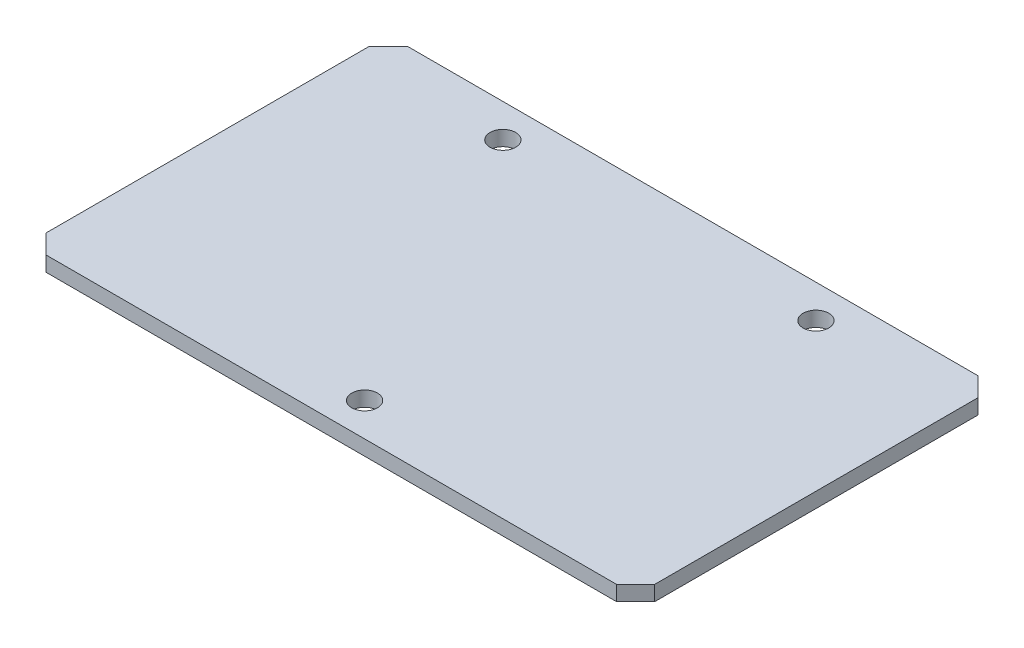
ISO-10303-21;
HEADER;
FILE_DESCRIPTION(('STEP AP214'),'2;1');
FILE_NAME('part.step','',(''),(''),'','','');
FILE_SCHEMA(('AUTOMOTIVE_DESIGN { 1 0 10303 214 1 1 1 1 }'));
ENDSEC;
DATA;
#1=APPLICATION_CONTEXT('core data for automotive mechanical design processes');
#2=APPLICATION_PROTOCOL_DEFINITION('international standard','automotive_design',2000,#1);
#3=PRODUCT_CONTEXT('',#1,'mechanical');
#4=PRODUCT('Part','Part','',(#3));
#5=PRODUCT_RELATED_PRODUCT_CATEGORY('part','',(#4));
#6=PRODUCT_DEFINITION_FORMATION('','',#4);
#7=PRODUCT_DEFINITION_CONTEXT('part definition',#1,'design');
#8=PRODUCT_DEFINITION('design','',#6,#7);
#9=PRODUCT_DEFINITION_SHAPE('','',#8);
#10=(LENGTH_UNIT() NAMED_UNIT(*) SI_UNIT(.MILLI.,.METRE.));
#11=(NAMED_UNIT(*) PLANE_ANGLE_UNIT() SI_UNIT($,.RADIAN.));
#12=(NAMED_UNIT(*) SI_UNIT($,.STERADIAN.) SOLID_ANGLE_UNIT());
#13=UNCERTAINTY_MEASURE_WITH_UNIT(LENGTH_MEASURE(1.E-05),#10,'distance_accuracy_value','');
#14=(GEOMETRIC_REPRESENTATION_CONTEXT(3) GLOBAL_UNCERTAINTY_ASSIGNED_CONTEXT((#13)) GLOBAL_UNIT_ASSIGNED_CONTEXT((#10,
#11,#12)) REPRESENTATION_CONTEXT('',''));
#15=CARTESIAN_POINT('',(0.,0.,0.));
#16=DIRECTION('',(0.,0.,1.));
#17=DIRECTION('',(1.,0.,0.));
#18=AXIS2_PLACEMENT_3D('',#15,#16,#17);
#19=CARTESIAN_POINT('',(32.,1.57875,19.));
#20=DIRECTION('',(-1.,0.,0.));
#21=DIRECTION('',(0.,0.,1.));
#22=AXIS2_PLACEMENT_3D('',#19,#20,#21);
#23=PLANE('',#22);
#24=DIRECTION('',(0.,0.,-1.));
#25=VECTOR('',#24,1.);
#26=CARTESIAN_POINT('',(32.,1.57875,19.));
#27=LINE('',#26,#25);
#28=CARTESIAN_POINT('',(32.,1.57875,17.));
#29=VERTEX_POINT('',#28);
#30=CARTESIAN_POINT('',(32.,1.57875,-17.));
#31=VERTEX_POINT('',#30);
#32=EDGE_CURVE('E125',#29,#31,#27,.T.);
#33=ORIENTED_EDGE('',*,*,#32,.F.);
#34=DIRECTION('',(0.,-1.,0.));
#35=VECTOR('',#34,1.);
#36=CARTESIAN_POINT('',(32.,1.57875,17.));
#37=LINE('',#36,#35);
#38=CARTESIAN_POINT('',(32.,0.,17.));
#39=VERTEX_POINT('',#38);
#40=EDGE_CURVE('E110',#29,#39,#37,.T.);
#41=ORIENTED_EDGE('',*,*,#40,.T.);
#42=DIRECTION('',(0.,0.,-1.));
#43=VECTOR('',#42,1.);
#44=CARTESIAN_POINT('',(32.,0.,19.));
#45=LINE('',#44,#43);
#46=CARTESIAN_POINT('',(32.,0.,-17.));
#47=VERTEX_POINT('',#46);
#48=EDGE_CURVE('E122',#39,#47,#45,.T.);
#49=ORIENTED_EDGE('',*,*,#48,.T.);
#50=DIRECTION('',(0.,1.,0.));
#51=VECTOR('',#50,1.);
#52=CARTESIAN_POINT('',(32.,1.57875,-17.));
#53=LINE('',#52,#51);
#54=EDGE_CURVE('E127',#47,#31,#53,.T.);
#55=ORIENTED_EDGE('',*,*,#54,.T.);
#56=EDGE_LOOP('',(#33,#41,#49,#55));
#57=FACE_BOUND('',#56,.T.);
#58=ADVANCED_FACE('F39',(#57),#23,.F.);
#59=CARTESIAN_POINT('',(-32.,1.57875,-19.));
#60=DIRECTION('',(0.,0.,1.));
#61=DIRECTION('',(1.,0.,0.));
#62=AXIS2_PLACEMENT_3D('',#59,#60,#61);
#63=PLANE('',#62);
#64=DIRECTION('',(-1.,0.,0.));
#65=VECTOR('',#64,1.);
#66=CARTESIAN_POINT('',(-32.,0.,-19.));
#67=LINE('',#66,#65);
#68=CARTESIAN_POINT('',(30.,0.,-19.));
#69=VERTEX_POINT('',#68);
#70=CARTESIAN_POINT('',(-30.,0.,-19.));
#71=VERTEX_POINT('',#70);
#72=EDGE_CURVE('E131',#69,#71,#67,.T.);
#73=ORIENTED_EDGE('',*,*,#72,.T.);
#74=DIRECTION('',(0.,1.,0.));
#75=VECTOR('',#74,1.);
#76=CARTESIAN_POINT('',(-30.,1.57875,-19.));
#77=LINE('',#76,#75);
#78=CARTESIAN_POINT('',(-30.,1.57875,-19.));
#79=VERTEX_POINT('',#78);
#80=EDGE_CURVE('E11',#71,#79,#77,.T.);
#81=ORIENTED_EDGE('',*,*,#80,.T.);
#82=DIRECTION('',(-1.,0.,0.));
#83=VECTOR('',#82,1.);
#84=CARTESIAN_POINT('',(-32.,1.57875,-19.));
#85=LINE('',#84,#83);
#86=CARTESIAN_POINT('',(30.,1.57875,-19.));
#87=VERTEX_POINT('',#86);
#88=EDGE_CURVE('E171',#87,#79,#85,.T.);
#89=ORIENTED_EDGE('',*,*,#88,.F.);
#90=DIRECTION('',(0.,-1.,0.));
#91=VECTOR('',#90,1.);
#92=CARTESIAN_POINT('',(30.,1.57875,-19.));
#93=LINE('',#92,#91);
#94=EDGE_CURVE('E48',#87,#69,#93,.T.);
#95=ORIENTED_EDGE('',*,*,#94,.T.);
#96=EDGE_LOOP('',(#73,#81,#89,#95));
#97=FACE_BOUND('',#96,.T.);
#98=ADVANCED_FACE('F169',(#97),#63,.F.);
#99=CARTESIAN_POINT('',(-32.,1.57875,19.));
#100=DIRECTION('',(1.,0.,0.));
#101=DIRECTION('',(0.,0.,-1.));
#102=AXIS2_PLACEMENT_3D('',#99,#100,#101);
#103=PLANE('',#102);
#104=DIRECTION('',(0.,0.,1.));
#105=VECTOR('',#104,1.);
#106=CARTESIAN_POINT('',(-32.,0.,19.));
#107=LINE('',#106,#105);
#108=CARTESIAN_POINT('',(-32.,0.,-17.));
#109=VERTEX_POINT('',#108);
#110=CARTESIAN_POINT('',(-32.,0.,17.));
#111=VERTEX_POINT('',#110);
#112=EDGE_CURVE('E135',#109,#111,#107,.T.);
#113=ORIENTED_EDGE('',*,*,#112,.T.);
#114=DIRECTION('',(0.,1.,0.));
#115=VECTOR('',#114,1.);
#116=CARTESIAN_POINT('',(-32.,1.57875,17.));
#117=LINE('',#116,#115);
#118=CARTESIAN_POINT('',(-32.,1.57875,17.));
#119=VERTEX_POINT('',#118);
#120=EDGE_CURVE('E55',#111,#119,#117,.T.);
#121=ORIENTED_EDGE('',*,*,#120,.T.);
#122=DIRECTION('',(0.,0.,1.));
#123=VECTOR('',#122,1.);
#124=CARTESIAN_POINT('',(-32.,1.57875,19.));
#125=LINE('',#124,#123);
#126=CARTESIAN_POINT('',(-32.,1.57875,-17.));
#127=VERTEX_POINT('',#126);
#128=EDGE_CURVE('E179',#127,#119,#125,.T.);
#129=ORIENTED_EDGE('',*,*,#128,.F.);
#130=DIRECTION('',(0.,-1.,0.));
#131=VECTOR('',#130,1.);
#132=CARTESIAN_POINT('',(-32.,1.57875,-17.));
#133=LINE('',#132,#131);
#134=EDGE_CURVE('E162',#127,#109,#133,.T.);
#135=ORIENTED_EDGE('',*,*,#134,.T.);
#136=EDGE_LOOP('',(#113,#121,#129,#135));
#137=FACE_BOUND('',#136,.T.);
#138=ADVANCED_FACE('F178',(#137),#103,.F.);
#139=CARTESIAN_POINT('',(-32.,1.57875,19.));
#140=DIRECTION('',(0.,0.,-1.));
#141=DIRECTION('',(-1.,0.,0.));
#142=AXIS2_PLACEMENT_3D('',#139,#140,#141);
#143=PLANE('',#142);
#144=DIRECTION('',(1.,0.,0.));
#145=VECTOR('',#144,1.);
#146=CARTESIAN_POINT('',(-32.,0.,19.));
#147=LINE('',#146,#145);
#148=CARTESIAN_POINT('',(-30.,0.,19.));
#149=VERTEX_POINT('',#148);
#150=CARTESIAN_POINT('',(30.,0.,19.));
#151=VERTEX_POINT('',#150);
#152=EDGE_CURVE('E145',#149,#151,#147,.T.);
#153=ORIENTED_EDGE('',*,*,#152,.T.);
#154=DIRECTION('',(0.,1.,0.));
#155=VECTOR('',#154,1.);
#156=CARTESIAN_POINT('',(30.,1.57875,19.));
#157=LINE('',#156,#155);
#158=CARTESIAN_POINT('',(30.,1.57875,19.));
#159=VERTEX_POINT('',#158);
#160=EDGE_CURVE('E111',#151,#159,#157,.T.);
#161=ORIENTED_EDGE('',*,*,#160,.T.);
#162=DIRECTION('',(1.,0.,0.));
#163=VECTOR('',#162,1.);
#164=CARTESIAN_POINT('',(-32.,1.57875,19.));
#165=LINE('',#164,#163);
#166=CARTESIAN_POINT('',(-30.,1.57875,19.));
#167=VERTEX_POINT('',#166);
#168=EDGE_CURVE('E141',#167,#159,#165,.T.);
#169=ORIENTED_EDGE('',*,*,#168,.F.);
#170=DIRECTION('',(0.,-1.,0.));
#171=VECTOR('',#170,1.);
#172=CARTESIAN_POINT('',(-30.,1.57875,19.));
#173=LINE('',#172,#171);
#174=EDGE_CURVE('E116',#167,#149,#173,.T.);
#175=ORIENTED_EDGE('',*,*,#174,.T.);
#176=EDGE_LOOP('',(#153,#161,#169,#175));
#177=FACE_BOUND('',#176,.T.);
#178=ADVANCED_FACE('F205',(#177),#143,.F.);
#179=CARTESIAN_POINT('',(0.,1.57875,0.));
#180=DIRECTION('',(0.,-1.,0.));
#181=DIRECTION('',(0.,0.,-1.));
#182=AXIS2_PLACEMENT_3D('',#179,#180,#181);
#183=PLANE('',#182);
#184=CARTESIAN_POINT('',(0.,1.57875,15.5));
#185=DIRECTION('',(0.,1.,0.));
#186=DIRECTION('',(0.,0.,1.));
#187=AXIS2_PLACEMENT_3D('',#184,#185,#186);
#188=CIRCLE('',#187,1.35);
#189=CARTESIAN_POINT('',(0.,1.57875,16.85));
#190=VERTEX_POINT('',#189);
#191=EDGE_CURVE('E138',#190,#190,#188,.T.);
#192=ORIENTED_EDGE('',*,*,#191,.F.);
#193=EDGE_LOOP('',(#192));
#194=FACE_BOUND('',#193,.T.);
#195=CARTESIAN_POINT('',(-16.46,1.57875,-15.5));
#196=DIRECTION('',(0.,1.,0.));
#197=DIRECTION('',(0.,0.,1.));
#198=AXIS2_PLACEMENT_3D('',#195,#196,#197);
#199=CIRCLE('',#198,1.35);
#200=CARTESIAN_POINT('',(-16.46,1.57875,-14.15));
#201=VERTEX_POINT('',#200);
#202=EDGE_CURVE('E194',#201,#201,#199,.T.);
#203=ORIENTED_EDGE('',*,*,#202,.F.);
#204=EDGE_LOOP('',(#203));
#205=FACE_BOUND('',#204,.T.);
#206=CARTESIAN_POINT('',(16.46,1.57875,-15.5));
#207=DIRECTION('',(0.,1.,0.));
#208=DIRECTION('',(0.,0.,1.));
#209=AXIS2_PLACEMENT_3D('',#206,#207,#208);
#210=CIRCLE('',#209,1.35);
#211=CARTESIAN_POINT('',(16.46,1.57875,-14.15));
#212=VERTEX_POINT('',#211);
#213=EDGE_CURVE('E188',#212,#212,#210,.T.);
#214=ORIENTED_EDGE('',*,*,#213,.F.);
#215=EDGE_LOOP('',(#214));
#216=FACE_BOUND('',#215,.T.);
#217=ORIENTED_EDGE('',*,*,#168,.T.);
#218=DIRECTION('',(-0.707106781186549,0.,0.707106781186546));
#219=VECTOR('',#218,1.);
#220=CARTESIAN_POINT('',(32.,1.57875,17.));
#221=LINE('',#220,#219);
#222=EDGE_CURVE('E160',#159,#29,#221,.F.);
#223=ORIENTED_EDGE('',*,*,#222,.T.);
#224=ORIENTED_EDGE('',*,*,#32,.T.);
#225=DIRECTION('',(0.707106781186548,0.,0.707106781186548));
#226=VECTOR('',#225,1.);
#227=CARTESIAN_POINT('',(30.,1.57875,-19.));
#228=LINE('',#227,#226);
#229=EDGE_CURVE('E155',#31,#87,#228,.F.);
#230=ORIENTED_EDGE('',*,*,#229,.T.);
#231=ORIENTED_EDGE('',*,*,#88,.T.);
#232=DIRECTION('',(0.707106781186549,0.,-0.707106781186546));
#233=VECTOR('',#232,1.);
#234=CARTESIAN_POINT('',(-32.,1.57875,-17.));
#235=LINE('',#234,#233);
#236=EDGE_CURVE('E62',#79,#127,#235,.F.);
#237=ORIENTED_EDGE('',*,*,#236,.T.);
#238=ORIENTED_EDGE('',*,*,#128,.T.);
#239=DIRECTION('',(-0.707106781186548,0.,-0.707106781186548));
#240=VECTOR('',#239,1.);
#241=CARTESIAN_POINT('',(-30.,1.57875,19.));
#242=LINE('',#241,#240);
#243=EDGE_CURVE('E158',#119,#167,#242,.F.);
#244=ORIENTED_EDGE('',*,*,#243,.T.);
#245=EDGE_LOOP('',(#217,#223,#224,#230,#231,#237,#238,#244));
#246=FACE_BOUND('',#245,.T.);
#247=ADVANCED_FACE('F202',(#194,#205,#216,#246),#183,.F.);
#248=CARTESIAN_POINT('',(0.,0.,0.));
#249=DIRECTION('',(0.,-1.,0.));
#250=DIRECTION('',(0.,0.,-1.));
#251=AXIS2_PLACEMENT_3D('',#248,#249,#250);
#252=PLANE('',#251);
#253=CARTESIAN_POINT('',(0.,0.,15.5));
#254=DIRECTION('',(0.,1.,0.));
#255=DIRECTION('',(0.,0.,1.));
#256=AXIS2_PLACEMENT_3D('',#253,#254,#255);
#257=CIRCLE('',#256,1.35);
#258=CARTESIAN_POINT('',(0.,0.,16.85));
#259=VERTEX_POINT('',#258);
#260=EDGE_CURVE('E132',#259,#259,#257,.T.);
#261=ORIENTED_EDGE('',*,*,#260,.T.);
#262=EDGE_LOOP('',(#261));
#263=FACE_BOUND('',#262,.T.);
#264=CARTESIAN_POINT('',(-16.46,0.,-15.5));
#265=DIRECTION('',(0.,1.,0.));
#266=DIRECTION('',(0.,0.,1.));
#267=AXIS2_PLACEMENT_3D('',#264,#265,#266);
#268=CIRCLE('',#267,1.35);
#269=CARTESIAN_POINT('',(-16.46,0.,-14.15));
#270=VERTEX_POINT('',#269);
#271=EDGE_CURVE('E191',#270,#270,#268,.T.);
#272=ORIENTED_EDGE('',*,*,#271,.T.);
#273=EDGE_LOOP('',(#272));
#274=FACE_BOUND('',#273,.T.);
#275=CARTESIAN_POINT('',(16.46,0.,-15.5));
#276=DIRECTION('',(0.,1.,0.));
#277=DIRECTION('',(0.,0.,1.));
#278=AXIS2_PLACEMENT_3D('',#275,#276,#277);
#279=CIRCLE('',#278,1.35);
#280=CARTESIAN_POINT('',(16.46,0.,-14.15));
#281=VERTEX_POINT('',#280);
#282=EDGE_CURVE('E185',#281,#281,#279,.T.);
#283=ORIENTED_EDGE('',*,*,#282,.T.);
#284=EDGE_LOOP('',(#283));
#285=FACE_BOUND('',#284,.T.);
#286=ORIENTED_EDGE('',*,*,#48,.F.);
#287=DIRECTION('',(0.707106781186549,0.,-0.707106781186546));
#288=VECTOR('',#287,1.);
#289=CARTESIAN_POINT('',(24.4999999999999,0.,24.5));
#290=LINE('',#289,#288);
#291=EDGE_CURVE('E106',#39,#151,#290,.F.);
#292=ORIENTED_EDGE('',*,*,#291,.T.);
#293=ORIENTED_EDGE('',*,*,#152,.F.);
#294=DIRECTION('',(0.707106781186548,0.,0.707106781186548));
#295=VECTOR('',#294,1.);
#296=CARTESIAN_POINT('',(-24.5,0.,24.5));
#297=LINE('',#296,#295);
#298=EDGE_CURVE('E117',#149,#111,#297,.F.);
#299=ORIENTED_EDGE('',*,*,#298,.T.);
#300=ORIENTED_EDGE('',*,*,#112,.F.);
#301=DIRECTION('',(-0.707106781186549,0.,0.707106781186546));
#302=VECTOR('',#301,1.);
#303=CARTESIAN_POINT('',(-24.4999999999999,0.,-24.5));
#304=LINE('',#303,#302);
#305=EDGE_CURVE('E149',#109,#71,#304,.F.);
#306=ORIENTED_EDGE('',*,*,#305,.T.);
#307=ORIENTED_EDGE('',*,*,#72,.F.);
#308=DIRECTION('',(-0.707106781186548,0.,-0.707106781186548));
#309=VECTOR('',#308,1.);
#310=CARTESIAN_POINT('',(24.5,0.,-24.5));
#311=LINE('',#310,#309);
#312=EDGE_CURVE('E126',#69,#47,#311,.F.);
#313=ORIENTED_EDGE('',*,*,#312,.T.);
#314=EDGE_LOOP('',(#286,#292,#293,#299,#300,#306,#307,#313));
#315=FACE_BOUND('',#314,.T.);
#316=ADVANCED_FACE('F129',(#263,#274,#285,#315),#252,.T.);
#317=CARTESIAN_POINT('',(32.,1.57875,17.));
#318=DIRECTION('',(-0.707106781186546,0.,-0.707106781186549));
#319=DIRECTION('',(0.,-1.,0.));
#320=AXIS2_PLACEMENT_3D('',#317,#318,#319);
#321=PLANE('',#320);
#322=ORIENTED_EDGE('',*,*,#222,.F.);
#323=ORIENTED_EDGE('',*,*,#160,.F.);
#324=ORIENTED_EDGE('',*,*,#291,.F.);
#325=ORIENTED_EDGE('',*,*,#40,.F.);
#326=EDGE_LOOP('',(#322,#323,#324,#325));
#327=FACE_BOUND('',#326,.T.);
#328=ADVANCED_FACE('F109',(#327),#321,.F.);
#329=CARTESIAN_POINT('',(-30.,1.57875,19.));
#330=DIRECTION('',(0.707106781186548,0.,-0.707106781186548));
#331=DIRECTION('',(0.,-1.,0.));
#332=AXIS2_PLACEMENT_3D('',#329,#330,#331);
#333=PLANE('',#332);
#334=ORIENTED_EDGE('',*,*,#243,.F.);
#335=ORIENTED_EDGE('',*,*,#120,.F.);
#336=ORIENTED_EDGE('',*,*,#298,.F.);
#337=ORIENTED_EDGE('',*,*,#174,.F.);
#338=EDGE_LOOP('',(#334,#335,#336,#337));
#339=FACE_BOUND('',#338,.T.);
#340=ADVANCED_FACE('F214',(#339),#333,.F.);
#341=CARTESIAN_POINT('',(-32.,1.57875,-17.));
#342=DIRECTION('',(0.707106781186546,0.,0.707106781186549));
#343=DIRECTION('',(0.,-1.,0.));
#344=AXIS2_PLACEMENT_3D('',#341,#342,#343);
#345=PLANE('',#344);
#346=ORIENTED_EDGE('',*,*,#236,.F.);
#347=ORIENTED_EDGE('',*,*,#80,.F.);
#348=ORIENTED_EDGE('',*,*,#305,.F.);
#349=ORIENTED_EDGE('',*,*,#134,.F.);
#350=EDGE_LOOP('',(#346,#347,#348,#349));
#351=FACE_BOUND('',#350,.T.);
#352=ADVANCED_FACE('F177',(#351),#345,.F.);
#353=CARTESIAN_POINT('',(30.,1.57875,-19.));
#354=DIRECTION('',(-0.707106781186548,0.,0.707106781186548));
#355=DIRECTION('',(0.,-1.,0.));
#356=AXIS2_PLACEMENT_3D('',#353,#354,#355);
#357=PLANE('',#356);
#358=ORIENTED_EDGE('',*,*,#229,.F.);
#359=ORIENTED_EDGE('',*,*,#54,.F.);
#360=ORIENTED_EDGE('',*,*,#312,.F.);
#361=ORIENTED_EDGE('',*,*,#94,.F.);
#362=EDGE_LOOP('',(#358,#359,#360,#361));
#363=FACE_BOUND('',#362,.T.);
#364=ADVANCED_FACE('F42',(#363),#357,.F.);
#365=CARTESIAN_POINT('',(16.46,0.,-15.5));
#366=DIRECTION('',(0.,1.,0.));
#367=DIRECTION('',(0.,0.,1.));
#368=AXIS2_PLACEMENT_3D('',#365,#366,#367);
#369=CYLINDRICAL_SURFACE('',#368,1.35);
#370=ORIENTED_EDGE('',*,*,#282,.F.);
#371=EDGE_LOOP('',(#370));
#372=FACE_BOUND('',#371,.T.);
#373=ORIENTED_EDGE('',*,*,#213,.T.);
#374=EDGE_LOOP('',(#373));
#375=FACE_BOUND('',#374,.T.);
#376=ADVANCED_FACE('F247',(#372,#375),#369,.F.);
#377=CARTESIAN_POINT('',(-16.46,0.,-15.5));
#378=DIRECTION('',(0.,1.,0.));
#379=DIRECTION('',(0.,0.,1.));
#380=AXIS2_PLACEMENT_3D('',#377,#378,#379);
#381=CYLINDRICAL_SURFACE('',#380,1.35);
#382=ORIENTED_EDGE('',*,*,#271,.F.);
#383=EDGE_LOOP('',(#382));
#384=FACE_BOUND('',#383,.T.);
#385=ORIENTED_EDGE('',*,*,#202,.T.);
#386=EDGE_LOOP('',(#385));
#387=FACE_BOUND('',#386,.T.);
#388=ADVANCED_FACE('F250',(#384,#387),#381,.F.);
#389=CARTESIAN_POINT('',(0.,0.,15.5));
#390=DIRECTION('',(0.,1.,0.));
#391=DIRECTION('',(0.,0.,1.));
#392=AXIS2_PLACEMENT_3D('',#389,#390,#391);
#393=CYLINDRICAL_SURFACE('',#392,1.35);
#394=ORIENTED_EDGE('',*,*,#260,.F.);
#395=EDGE_LOOP('',(#394));
#396=FACE_BOUND('',#395,.T.);
#397=ORIENTED_EDGE('',*,*,#191,.T.);
#398=EDGE_LOOP('',(#397));
#399=FACE_BOUND('',#398,.T.);
#400=ADVANCED_FACE('F200',(#396,#399),#393,.F.);
#401=CLOSED_SHELL('',(#58,#98,#138,#178,#247,#316,#328,#340,#352,#364,#376,#388,#400));
#402=MANIFOLD_SOLID_BREP('B2',#401);
#403=ADVANCED_BREP_SHAPE_REPRESENTATION('',(#18,#402),#14);
#404=SHAPE_DEFINITION_REPRESENTATION(#9,#403);
ENDSEC;
END-ISO-10303-21;
